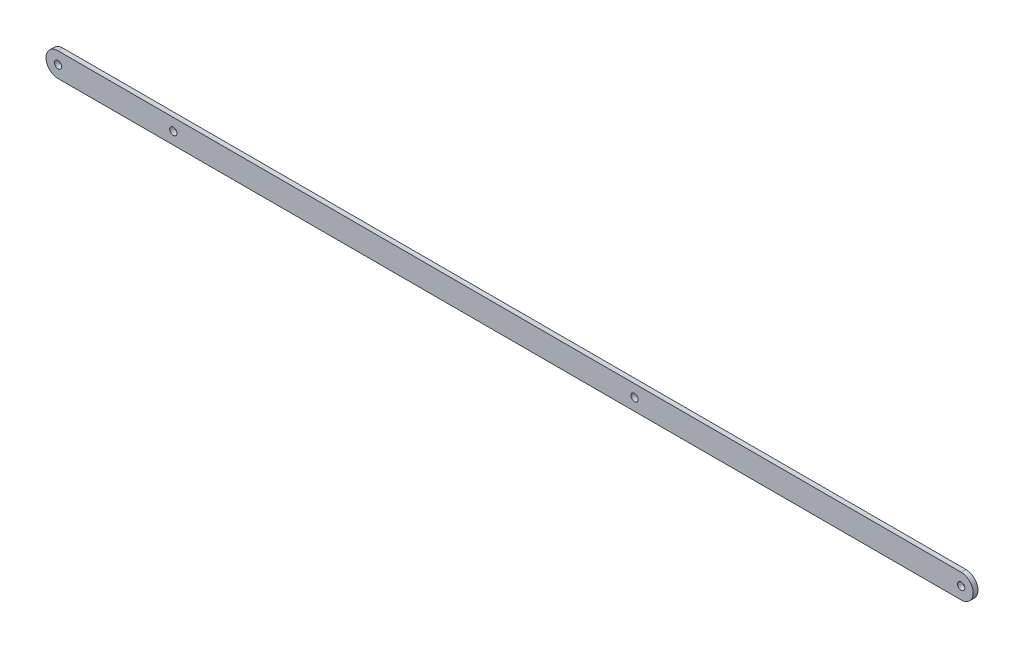
ISO-10303-21;
HEADER;
FILE_DESCRIPTION(('STEP AP214'),'2;1');
FILE_NAME('part.step','',(''),(''),'','','');
FILE_SCHEMA(('AUTOMOTIVE_DESIGN { 1 0 10303 214 1 1 1 1 }'));
ENDSEC;
DATA;
#1=APPLICATION_CONTEXT('core data for automotive mechanical design processes');
#2=APPLICATION_PROTOCOL_DEFINITION('international standard','automotive_design',2000,#1);
#3=PRODUCT_CONTEXT('',#1,'mechanical');
#4=PRODUCT('Part','Part','',(#3));
#5=PRODUCT_RELATED_PRODUCT_CATEGORY('part','',(#4));
#6=PRODUCT_DEFINITION_FORMATION('','',#4);
#7=PRODUCT_DEFINITION_CONTEXT('part definition',#1,'design');
#8=PRODUCT_DEFINITION('design','',#6,#7);
#9=PRODUCT_DEFINITION_SHAPE('','',#8);
#10=(LENGTH_UNIT() NAMED_UNIT(*) SI_UNIT(.MILLI.,.METRE.));
#11=(NAMED_UNIT(*) PLANE_ANGLE_UNIT() SI_UNIT($,.RADIAN.));
#12=(NAMED_UNIT(*) SI_UNIT($,.STERADIAN.) SOLID_ANGLE_UNIT());
#13=UNCERTAINTY_MEASURE_WITH_UNIT(LENGTH_MEASURE(1.E-05),#10,'distance_accuracy_value','');
#14=(GEOMETRIC_REPRESENTATION_CONTEXT(3) GLOBAL_UNCERTAINTY_ASSIGNED_CONTEXT((#13)) GLOBAL_UNIT_ASSIGNED_CONTEXT((#10,
#11,#12)) REPRESENTATION_CONTEXT('',''));
#15=CARTESIAN_POINT('',(0.,0.,0.));
#16=DIRECTION('',(0.,0.,1.));
#17=DIRECTION('',(1.,0.,0.));
#18=AXIS2_PLACEMENT_3D('',#15,#16,#17);
#19=CARTESIAN_POINT('',(596.9,1.79209607838327E-13,3.175));
#20=DIRECTION('',(0.,0.,1.));
#21=DIRECTION('',(1.,0.,0.));
#22=AXIS2_PLACEMENT_3D('',#19,#20,#21);
#23=PLANE('',#22);
#24=CARTESIAN_POINT('',(-444.5,0.,3.175));
#25=DIRECTION('',(0.,0.,1.));
#26=DIRECTION('',(1.,0.,0.));
#27=AXIS2_PLACEMENT_3D('',#24,#25,#26);
#28=CIRCLE('',#27,4.76250000000001);
#29=CARTESIAN_POINT('',(-439.7375,0.,3.175));
#30=VERTEX_POINT('',#29);
#31=EDGE_CURVE('E134',#30,#30,#28,.T.);
#32=ORIENTED_EDGE('',*,*,#31,.F.);
#33=EDGE_LOOP('',(#32));
#34=FACE_BOUND('',#33,.T.);
#35=CARTESIAN_POINT('',(165.1,0.,3.175));
#36=DIRECTION('',(0.,0.,1.));
#37=DIRECTION('',(1.,0.,0.));
#38=AXIS2_PLACEMENT_3D('',#35,#36,#37);
#39=CIRCLE('',#38,4.76250000000001);
#40=CARTESIAN_POINT('',(169.8625,0.,3.175));
#41=VERTEX_POINT('',#40);
#42=EDGE_CURVE('E128',#41,#41,#39,.T.);
#43=ORIENTED_EDGE('',*,*,#42,.F.);
#44=EDGE_LOOP('',(#43));
#45=FACE_BOUND('',#44,.T.);
#46=CARTESIAN_POINT('',(-596.9,0.,3.175));
#47=DIRECTION('',(0.,0.,1.));
#48=DIRECTION('',(1.,0.,0.));
#49=AXIS2_PLACEMENT_3D('',#46,#47,#48);
#50=CIRCLE('',#49,4.76250000000001);
#51=CARTESIAN_POINT('',(-592.1375,0.,3.175));
#52=VERTEX_POINT('',#51);
#53=EDGE_CURVE('E104',#52,#52,#50,.T.);
#54=ORIENTED_EDGE('',*,*,#53,.F.);
#55=EDGE_LOOP('',(#54));
#56=FACE_BOUND('',#55,.T.);
#57=CARTESIAN_POINT('',(596.9,1.79209607838327E-13,3.175));
#58=DIRECTION('',(0.,0.,1.));
#59=DIRECTION('',(1.,0.,0.));
#60=AXIS2_PLACEMENT_3D('',#57,#58,#59);
#61=CIRCLE('',#60,15.875);
#62=CARTESIAN_POINT('',(596.9,-15.8750000000002,3.175));
#63=VERTEX_POINT('',#62);
#64=CARTESIAN_POINT('',(596.9,15.8749999999998,3.175));
#65=VERTEX_POINT('',#64);
#66=EDGE_CURVE('E89',#63,#65,#61,.T.);
#67=ORIENTED_EDGE('',*,*,#66,.T.);
#68=DIRECTION('',(-1.,0.,0.));
#69=VECTOR('',#68,1.);
#70=CARTESIAN_POINT('',(596.9,15.8749999999998,3.175));
#71=LINE('',#70,#69);
#72=CARTESIAN_POINT('',(-596.9,15.875,3.175));
#73=VERTEX_POINT('',#72);
#74=EDGE_CURVE('E84',#65,#73,#71,.T.);
#75=ORIENTED_EDGE('',*,*,#74,.T.);
#76=CARTESIAN_POINT('',(-596.9,0.,3.175));
#77=DIRECTION('',(0.,0.,1.));
#78=DIRECTION('',(1.,0.,0.));
#79=AXIS2_PLACEMENT_3D('',#76,#77,#78);
#80=CIRCLE('',#79,15.875);
#81=CARTESIAN_POINT('',(-596.9,-15.8750000000003,3.175));
#82=VERTEX_POINT('',#81);
#83=EDGE_CURVE('E87',#73,#82,#80,.T.);
#84=ORIENTED_EDGE('',*,*,#83,.T.);
#85=DIRECTION('',(1.,0.,0.));
#86=VECTOR('',#85,1.);
#87=CARTESIAN_POINT('',(596.9,-15.8750000000002,3.175));
#88=LINE('',#87,#86);
#89=EDGE_CURVE('E54',#82,#63,#88,.T.);
#90=ORIENTED_EDGE('',*,*,#89,.T.);
#91=EDGE_LOOP('',(#67,#75,#84,#90));
#92=FACE_BOUND('',#91,.T.);
#93=CARTESIAN_POINT('',(596.9,1.79209607838327E-13,3.175));
#94=DIRECTION('',(0.,0.,1.));
#95=DIRECTION('',(1.,0.,0.));
#96=AXIS2_PLACEMENT_3D('',#93,#94,#95);
#97=CIRCLE('',#96,4.76250000000001);
#98=CARTESIAN_POINT('',(601.6625,1.79209607838327E-13,3.175));
#99=VERTEX_POINT('',#98);
#100=EDGE_CURVE('E119',#99,#99,#97,.T.);
#101=ORIENTED_EDGE('',*,*,#100,.F.);
#102=EDGE_LOOP('',(#101));
#103=FACE_BOUND('',#102,.T.);
#104=ADVANCED_FACE('F37',(#34,#45,#56,#92,#103),#23,.T.);
#105=CARTESIAN_POINT('',(596.9,1.79209607838327E-13,-3.175));
#106=DIRECTION('',(0.,0.,1.));
#107=DIRECTION('',(1.,0.,0.));
#108=AXIS2_PLACEMENT_3D('',#105,#106,#107);
#109=PLANE('',#108);
#110=CARTESIAN_POINT('',(-444.5,0.,-3.175));
#111=DIRECTION('',(0.,0.,1.));
#112=DIRECTION('',(1.,0.,0.));
#113=AXIS2_PLACEMENT_3D('',#110,#111,#112);
#114=CIRCLE('',#113,4.76250000000001);
#115=CARTESIAN_POINT('',(-439.7375,0.,-3.175));
#116=VERTEX_POINT('',#115);
#117=EDGE_CURVE('E125',#116,#116,#114,.T.);
#118=ORIENTED_EDGE('',*,*,#117,.T.);
#119=EDGE_LOOP('',(#118));
#120=FACE_BOUND('',#119,.T.);
#121=CARTESIAN_POINT('',(165.1,0.,-3.175));
#122=DIRECTION('',(0.,0.,1.));
#123=DIRECTION('',(1.,0.,0.));
#124=AXIS2_PLACEMENT_3D('',#121,#122,#123);
#125=CIRCLE('',#124,4.76250000000001);
#126=CARTESIAN_POINT('',(169.8625,0.,-3.175));
#127=VERTEX_POINT('',#126);
#128=EDGE_CURVE('E131',#127,#127,#125,.T.);
#129=ORIENTED_EDGE('',*,*,#128,.T.);
#130=EDGE_LOOP('',(#129));
#131=FACE_BOUND('',#130,.T.);
#132=CARTESIAN_POINT('',(596.9,1.79209607838327E-13,-3.175));
#133=DIRECTION('',(0.,0.,1.));
#134=DIRECTION('',(1.,0.,0.));
#135=AXIS2_PLACEMENT_3D('',#132,#133,#134);
#136=CIRCLE('',#135,15.875);
#137=CARTESIAN_POINT('',(596.9,-15.8750000000002,-3.175));
#138=VERTEX_POINT('',#137);
#139=CARTESIAN_POINT('',(596.9,15.8749999999998,-3.175));
#140=VERTEX_POINT('',#139);
#141=EDGE_CURVE('E101',#138,#140,#136,.T.);
#142=ORIENTED_EDGE('',*,*,#141,.F.);
#143=DIRECTION('',(1.,0.,0.));
#144=VECTOR('',#143,1.);
#145=CARTESIAN_POINT('',(596.9,-15.8750000000002,-3.175));
#146=LINE('',#145,#144);
#147=CARTESIAN_POINT('',(-596.9,-15.8750000000003,-3.175));
#148=VERTEX_POINT('',#147);
#149=EDGE_CURVE('E77',#148,#138,#146,.T.);
#150=ORIENTED_EDGE('',*,*,#149,.F.);
#151=CARTESIAN_POINT('',(-596.9,0.,-3.175));
#152=DIRECTION('',(0.,0.,1.));
#153=DIRECTION('',(1.,0.,0.));
#154=AXIS2_PLACEMENT_3D('',#151,#152,#153);
#155=CIRCLE('',#154,15.875);
#156=CARTESIAN_POINT('',(-596.9,15.875,-3.175));
#157=VERTEX_POINT('',#156);
#158=EDGE_CURVE('E71',#157,#148,#155,.T.);
#159=ORIENTED_EDGE('',*,*,#158,.F.);
#160=DIRECTION('',(-1.,0.,0.));
#161=VECTOR('',#160,1.);
#162=CARTESIAN_POINT('',(596.9,15.8749999999998,-3.175));
#163=LINE('',#162,#161);
#164=EDGE_CURVE('E93',#140,#157,#163,.T.);
#165=ORIENTED_EDGE('',*,*,#164,.F.);
#166=EDGE_LOOP('',(#142,#150,#159,#165));
#167=FACE_BOUND('',#166,.T.);
#168=CARTESIAN_POINT('',(-596.9,0.,-3.175));
#169=DIRECTION('',(0.,0.,1.));
#170=DIRECTION('',(1.,0.,0.));
#171=AXIS2_PLACEMENT_3D('',#168,#169,#170);
#172=CIRCLE('',#171,4.76250000000001);
#173=CARTESIAN_POINT('',(-592.1375,0.,-3.175));
#174=VERTEX_POINT('',#173);
#175=EDGE_CURVE('E116',#174,#174,#172,.T.);
#176=ORIENTED_EDGE('',*,*,#175,.T.);
#177=EDGE_LOOP('',(#176));
#178=FACE_BOUND('',#177,.T.);
#179=CARTESIAN_POINT('',(596.9,1.79209607838327E-13,-3.175));
#180=DIRECTION('',(0.,0.,1.));
#181=DIRECTION('',(1.,0.,0.));
#182=AXIS2_PLACEMENT_3D('',#179,#180,#181);
#183=CIRCLE('',#182,4.76250000000001);
#184=CARTESIAN_POINT('',(601.6625,1.79209607838327E-13,-3.175));
#185=VERTEX_POINT('',#184);
#186=EDGE_CURVE('E122',#185,#185,#183,.T.);
#187=ORIENTED_EDGE('',*,*,#186,.T.);
#188=EDGE_LOOP('',(#187));
#189=FACE_BOUND('',#188,.T.);
#190=ADVANCED_FACE('F112',(#120,#131,#167,#178,#189),#109,.F.);
#191=CARTESIAN_POINT('',(596.9,1.79209607838327E-13,3.175));
#192=DIRECTION('',(0.,0.,-1.));
#193=DIRECTION('',(-1.,0.,0.));
#194=AXIS2_PLACEMENT_3D('',#191,#192,#193);
#195=CYLINDRICAL_SURFACE('',#194,15.875);
#196=ORIENTED_EDGE('',*,*,#141,.T.);
#197=DIRECTION('',(0.,0.,-1.));
#198=VECTOR('',#197,1.);
#199=CARTESIAN_POINT('',(596.9,15.8749999999998,3.175));
#200=LINE('',#199,#198);
#201=EDGE_CURVE('E11',#65,#140,#200,.T.);
#202=ORIENTED_EDGE('',*,*,#201,.F.);
#203=ORIENTED_EDGE('',*,*,#66,.F.);
#204=DIRECTION('',(0.,0.,-1.));
#205=VECTOR('',#204,1.);
#206=CARTESIAN_POINT('',(596.9,-15.8750000000002,3.175));
#207=LINE('',#206,#205);
#208=EDGE_CURVE('E97',#63,#138,#207,.T.);
#209=ORIENTED_EDGE('',*,*,#208,.T.);
#210=EDGE_LOOP('',(#196,#202,#203,#209));
#211=FACE_BOUND('',#210,.T.);
#212=ADVANCED_FACE('F39',(#211),#195,.T.);
#213=CARTESIAN_POINT('',(596.9,15.8749999999998,3.175));
#214=DIRECTION('',(0.,-1.,0.));
#215=DIRECTION('',(1.,0.,0.));
#216=AXIS2_PLACEMENT_3D('',#213,#214,#215);
#217=PLANE('',#216);
#218=ORIENTED_EDGE('',*,*,#164,.T.);
#219=DIRECTION('',(0.,0.,-1.));
#220=VECTOR('',#219,1.);
#221=CARTESIAN_POINT('',(-596.9,15.875,3.175));
#222=LINE('',#221,#220);
#223=EDGE_CURVE('E46',#73,#157,#222,.T.);
#224=ORIENTED_EDGE('',*,*,#223,.F.);
#225=ORIENTED_EDGE('',*,*,#74,.F.);
#226=ORIENTED_EDGE('',*,*,#201,.T.);
#227=EDGE_LOOP('',(#218,#224,#225,#226));
#228=FACE_BOUND('',#227,.T.);
#229=ADVANCED_FACE('F92',(#228),#217,.F.);
#230=CARTESIAN_POINT('',(-596.9,0.,3.175));
#231=DIRECTION('',(0.,0.,-1.));
#232=DIRECTION('',(-1.,0.,0.));
#233=AXIS2_PLACEMENT_3D('',#230,#231,#232);
#234=CYLINDRICAL_SURFACE('',#233,15.875);
#235=ORIENTED_EDGE('',*,*,#158,.T.);
#236=DIRECTION('',(0.,0.,-1.));
#237=VECTOR('',#236,1.);
#238=CARTESIAN_POINT('',(-596.9,-15.8750000000003,3.175));
#239=LINE('',#238,#237);
#240=EDGE_CURVE('E94',#82,#148,#239,.T.);
#241=ORIENTED_EDGE('',*,*,#240,.F.);
#242=ORIENTED_EDGE('',*,*,#83,.F.);
#243=ORIENTED_EDGE('',*,*,#223,.T.);
#244=EDGE_LOOP('',(#235,#241,#242,#243));
#245=FACE_BOUND('',#244,.T.);
#246=ADVANCED_FACE('F95',(#245),#234,.T.);
#247=CARTESIAN_POINT('',(596.9,-15.8750000000002,3.175));
#248=DIRECTION('',(0.,1.,0.));
#249=DIRECTION('',(-1.,0.,0.));
#250=AXIS2_PLACEMENT_3D('',#247,#248,#249);
#251=PLANE('',#250);
#252=ORIENTED_EDGE('',*,*,#149,.T.);
#253=ORIENTED_EDGE('',*,*,#208,.F.);
#254=ORIENTED_EDGE('',*,*,#89,.F.);
#255=ORIENTED_EDGE('',*,*,#240,.T.);
#256=EDGE_LOOP('',(#252,#253,#254,#255));
#257=FACE_BOUND('',#256,.T.);
#258=ADVANCED_FACE('F109',(#257),#251,.F.);
#259=CARTESIAN_POINT('',(-596.9,0.,3.175));
#260=DIRECTION('',(0.,0.,-1.));
#261=DIRECTION('',(-1.,0.,0.));
#262=AXIS2_PLACEMENT_3D('',#259,#260,#261);
#263=CYLINDRICAL_SURFACE('',#262,4.76250000000001);
#264=ORIENTED_EDGE('',*,*,#53,.T.);
#265=EDGE_LOOP('',(#264));
#266=FACE_BOUND('',#265,.T.);
#267=ORIENTED_EDGE('',*,*,#175,.F.);
#268=EDGE_LOOP('',(#267));
#269=FACE_BOUND('',#268,.T.);
#270=ADVANCED_FACE('F156',(#266,#269),#263,.F.);
#271=CARTESIAN_POINT('',(596.9,1.79209607838327E-13,3.175));
#272=DIRECTION('',(0.,0.,-1.));
#273=DIRECTION('',(-1.,0.,0.));
#274=AXIS2_PLACEMENT_3D('',#271,#272,#273);
#275=CYLINDRICAL_SURFACE('',#274,4.76250000000001);
#276=ORIENTED_EDGE('',*,*,#100,.T.);
#277=EDGE_LOOP('',(#276));
#278=FACE_BOUND('',#277,.T.);
#279=ORIENTED_EDGE('',*,*,#186,.F.);
#280=EDGE_LOOP('',(#279));
#281=FACE_BOUND('',#280,.T.);
#282=ADVANCED_FACE('F159',(#278,#281),#275,.F.);
#283=CARTESIAN_POINT('',(165.1,0.,-3.175));
#284=DIRECTION('',(0.,0.,1.));
#285=DIRECTION('',(1.,0.,0.));
#286=AXIS2_PLACEMENT_3D('',#283,#284,#285);
#287=CYLINDRICAL_SURFACE('',#286,4.76250000000001);
#288=ORIENTED_EDGE('',*,*,#128,.F.);
#289=EDGE_LOOP('',(#288));
#290=FACE_BOUND('',#289,.T.);
#291=ORIENTED_EDGE('',*,*,#42,.T.);
#292=EDGE_LOOP('',(#291));
#293=FACE_BOUND('',#292,.T.);
#294=ADVANCED_FACE('F145',(#290,#293),#287,.F.);
#295=CARTESIAN_POINT('',(-444.5,0.,-3.175));
#296=DIRECTION('',(0.,0.,1.));
#297=DIRECTION('',(1.,0.,0.));
#298=AXIS2_PLACEMENT_3D('',#295,#296,#297);
#299=CYLINDRICAL_SURFACE('',#298,4.76250000000001);
#300=ORIENTED_EDGE('',*,*,#117,.F.);
#301=EDGE_LOOP('',(#300));
#302=FACE_BOUND('',#301,.T.);
#303=ORIENTED_EDGE('',*,*,#31,.T.);
#304=EDGE_LOOP('',(#303));
#305=FACE_BOUND('',#304,.T.);
#306=ADVANCED_FACE('F142',(#302,#305),#299,.F.);
#307=CLOSED_SHELL('',(#104,#190,#212,#229,#246,#258,#270,#282,#294,#306));
#308=MANIFOLD_SOLID_BREP('B2',#307);
#309=ADVANCED_BREP_SHAPE_REPRESENTATION('',(#18,#308),#14);
#310=SHAPE_DEFINITION_REPRESENTATION(#9,#309);
ENDSEC;
END-ISO-10303-21;
